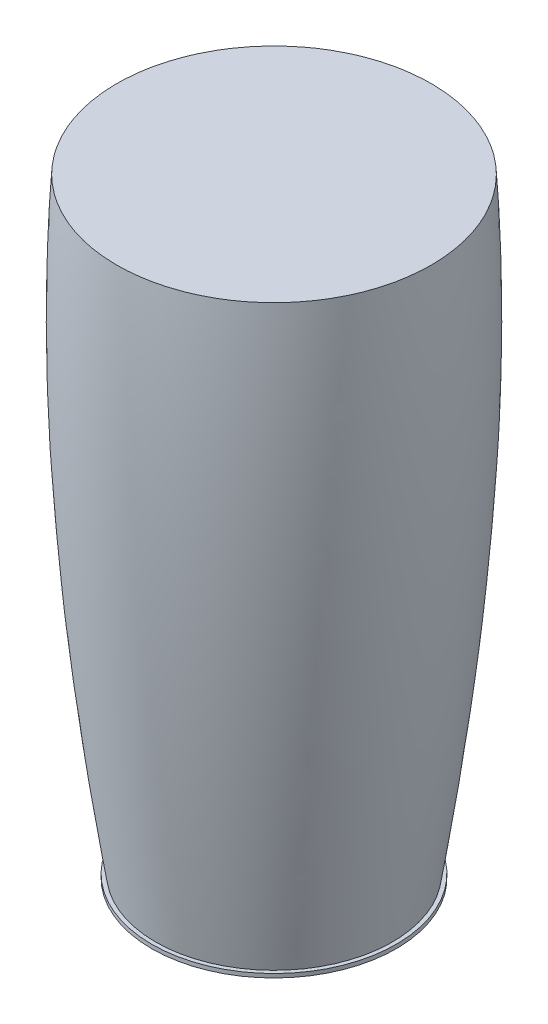
ISO-10303-21;
HEADER;
FILE_DESCRIPTION(('STEP AP214'),'2;1');
FILE_NAME('part.step','',(''),(''),'','','');
FILE_SCHEMA(('AUTOMOTIVE_DESIGN { 1 0 10303 214 1 1 1 1 }'));
ENDSEC;
DATA;
#1=APPLICATION_CONTEXT('core data for automotive mechanical design processes');
#2=APPLICATION_PROTOCOL_DEFINITION('international standard','automotive_design',2000,#1);
#3=PRODUCT_CONTEXT('',#1,'mechanical');
#4=PRODUCT('Part','Part','',(#3));
#5=PRODUCT_RELATED_PRODUCT_CATEGORY('part','',(#4));
#6=PRODUCT_DEFINITION_FORMATION('','',#4);
#7=PRODUCT_DEFINITION_CONTEXT('part definition',#1,'design');
#8=PRODUCT_DEFINITION('design','',#6,#7);
#9=PRODUCT_DEFINITION_SHAPE('','',#8);
#10=(LENGTH_UNIT() NAMED_UNIT(*) SI_UNIT(.MILLI.,.METRE.));
#11=(NAMED_UNIT(*) PLANE_ANGLE_UNIT() SI_UNIT($,.RADIAN.));
#12=(NAMED_UNIT(*) SI_UNIT($,.STERADIAN.) SOLID_ANGLE_UNIT());
#13=UNCERTAINTY_MEASURE_WITH_UNIT(LENGTH_MEASURE(1.E-05),#10,'distance_accuracy_value','');
#14=(GEOMETRIC_REPRESENTATION_CONTEXT(3) GLOBAL_UNCERTAINTY_ASSIGNED_CONTEXT((#13)) GLOBAL_UNIT_ASSIGNED_CONTEXT((#10,
#11,#12)) REPRESENTATION_CONTEXT('',''));
#15=CARTESIAN_POINT('',(0.,0.,0.));
#16=DIRECTION('',(0.,0.,1.));
#17=DIRECTION('',(1.,0.,0.));
#18=AXIS2_PLACEMENT_3D('',#15,#16,#17);
#19=CARTESIAN_POINT('',(0.,1.,0.));
#20=DIRECTION('',(0.,1.,0.));
#21=DIRECTION('',(0.,0.,1.));
#22=AXIS2_PLACEMENT_3D('',#19,#20,#21);
#23=PLANE('',#22);
#24=CARTESIAN_POINT('',(0.,1.,0.));
#25=DIRECTION('',(0.,1.,0.));
#26=DIRECTION('',(0.,0.,1.));
#27=AXIS2_PLACEMENT_3D('',#24,#25,#26);
#28=CIRCLE('',#27,31.5);
#29=CARTESIAN_POINT('',(0.,1.,31.5));
#30=VERTEX_POINT('',#29);
#31=EDGE_CURVE('E11',#30,#30,#28,.T.);
#32=ORIENTED_EDGE('',*,*,#31,.T.);
#33=EDGE_LOOP('',(#32));
#34=FACE_BOUND('',#33,.T.);
#35=CARTESIAN_POINT('',(0.,1.,30.5));
#36=CARTESIAN_POINT('',(-1.99622021113738,1.,30.5));
#37=CARTESIAN_POINT('',(-5.98860372197836,1.,30.1069005766433));
#38=CARTESIAN_POINT('',(-11.7471088562175,0.999999999999997,28.3600017935858));
#39=CARTESIAN_POINT('',(-17.0541550319744,1.,25.5233667280083));
#40=CARTESIAN_POINT('',(-21.7058434697171,1.,21.7058050700122));
#41=CARTESIAN_POINT('',(-25.5233621193165,1.,17.0541235463825));
#42=CARTESIAN_POINT('',(-28.3600384210798,1.,11.7470938791449));
#43=CARTESIAN_POINT('',(-30.1068435850172,1.,5.98861290712943));
#44=CARTESIAN_POINT('',(-30.6966743261942,0.999999999999998,-5.14611795017494E-07));
#45=CARTESIAN_POINT('',(-30.1068437438445,1.,-5.98861167144551));
#46=CARTESIAN_POINT('',(-28.3600380396234,0.999999999999998,-11.7470958223786));
#47=CARTESIAN_POINT('',(-25.5233629004458,1.,-17.0541200068778));
#48=CARTESIAN_POINT('',(-21.705841657347,0.999999999999998,-21.7058129926407));
#49=CARTESIAN_POINT('',(-17.0541585029317,1.,-25.5233516935576));
#50=CARTESIAN_POINT('',(-11.7471024831886,0.999999999999999,-28.3600293384688));
#51=CARTESIAN_POINT('',(-5.98861588752967,1.,-30.1068479892804));
#52=CARTESIAN_POINT('',(0.,1.,-30.6966694551992));
#53=CARTESIAN_POINT('',(5.98861588752953,0.999999999999999,-30.1068479892805));
#54=CARTESIAN_POINT('',(11.7471024831885,1.,-28.3600293384687));
#55=CARTESIAN_POINT('',(17.0541585029315,0.999999999999999,-25.5233516935577));
#56=CARTESIAN_POINT('',(21.7058416573471,1.,-21.7058129926409));
#57=CARTESIAN_POINT('',(25.5233629004457,0.999999999999997,-17.0541200068779));
#58=CARTESIAN_POINT('',(28.3600380396234,1.,-11.7470958223786));
#59=CARTESIAN_POINT('',(30.1068437438445,1.,-5.98861167144559));
#60=CARTESIAN_POINT('',(30.6966743261942,0.999999999999999,-5.14611899100903E-07));
#61=CARTESIAN_POINT('',(30.1068435850172,1.,5.98861290712939));
#62=CARTESIAN_POINT('',(28.3600384210799,1.,11.7470938791448));
#63=CARTESIAN_POINT('',(25.5233621193166,1.,17.0541235463825));
#64=CARTESIAN_POINT('',(21.7058434697173,1.,21.705805070012));
#65=CARTESIAN_POINT('',(17.0541550319745,0.999999999999999,25.5233667280082));
#66=CARTESIAN_POINT('',(11.7471088562177,1.,28.3600017935857));
#67=CARTESIAN_POINT('',(5.98860372197847,1.,30.1069005766432));
#68=CARTESIAN_POINT('',(1.99622021113738,1.,30.5));
#69=CARTESIAN_POINT('',(0.,1.,30.5));
#70=B_SPLINE_CURVE_WITH_KNOTS('',3,(#35,#36,#37,#38,#39,#40,#41,#42,#43,#44,#45,#46,#47,#48,#49,
#50,#51,#52,#53,#54,#55,#56,#57,#58,#59,#60,#61,#62,#63,#64,#65,#66,#67,#68,#69),.UNSPECIFIED.,
.T.,.F.,(4,1,1,1,1,1,1,1,1,1,1,1,1,1,1,1,1,1,1,1,1,1,1,1,1,1,1,1,1,1,1,1,4),(0.,0.03125,0.0625,
0.09375,0.125,0.15625,0.1875,0.21875,0.25,0.28125,0.3125,0.34375,0.375,0.40625,0.4375,0.46875,
0.5,0.53125,0.5625,0.59375,0.625,0.65625,0.6875,0.71875,0.75,0.78125,0.8125,0.84375,0.875,
0.90625,0.9375,0.96875,1.),.UNSPECIFIED.);
#71=CARTESIAN_POINT('',(0.,1.,30.5));
#72=VERTEX_POINT('',#71);
#73=EDGE_CURVE('E123',#72,#72,#70,.T.);
#74=ORIENTED_EDGE('',*,*,#73,.T.);
#75=EDGE_LOOP('',(#74));
#76=FACE_BOUND('',#75,.T.);
#77=ADVANCED_FACE('F103',(#34,#76),#23,.T.);
#78=CARTESIAN_POINT('',(0.,1.,0.));
#79=DIRECTION('',(0.,-1.,0.));
#80=DIRECTION('',(0.,0.,-1.));
#81=AXIS2_PLACEMENT_3D('',#78,#79,#80);
#82=CYLINDRICAL_SURFACE('',#81,31.5);
#83=ORIENTED_EDGE('',*,*,#31,.F.);
#84=EDGE_LOOP('',(#83));
#85=FACE_BOUND('',#84,.T.);
#86=CARTESIAN_POINT('',(0.,0.,0.));
#87=DIRECTION('',(0.,1.,0.));
#88=DIRECTION('',(0.,0.,1.));
#89=AXIS2_PLACEMENT_3D('',#86,#87,#88);
#90=CIRCLE('',#89,31.5);
#91=CARTESIAN_POINT('',(0.,0.,31.5));
#92=VERTEX_POINT('',#91);
#93=EDGE_CURVE('E107',#92,#92,#90,.T.);
#94=ORIENTED_EDGE('',*,*,#93,.T.);
#95=EDGE_LOOP('',(#94));
#96=FACE_BOUND('',#95,.T.);
#97=ADVANCED_FACE('F105',(#85,#96),#82,.T.);
#98=CARTESIAN_POINT('',(0.,0.,0.));
#99=DIRECTION('',(0.,1.,0.));
#100=DIRECTION('',(0.,0.,1.));
#101=AXIS2_PLACEMENT_3D('',#98,#99,#100);
#102=PLANE('',#101);
#103=ORIENTED_EDGE('',*,*,#93,.F.);
#104=EDGE_LOOP('',(#103));
#105=FACE_BOUND('',#104,.T.);
#106=ADVANCED_FACE('F145',(#105),#102,.F.);
#107=CARTESIAN_POINT('',(0.,157.,-40.5000826480815));
#108=DIRECTION('',(0.,1.,-3.19037673435257E-13));
#109=DIRECTION('',(0.,3.19037673435257E-13,1.));
#110=AXIS2_PLACEMENT_3D('',#107,#108,#109);
#111=PLANE('',#110);
#112=CARTESIAN_POINT('',(0.,157.,40.5));
#113=CARTESIAN_POINT('',(-2.65071864101849,157.,40.5));
#114=CARTESIAN_POINT('',(-7.95209506455382,157.,39.9780132016993));
#115=CARTESIAN_POINT('',(-15.5986293166789,157.,37.6583593965726));
#116=CARTESIAN_POINT('',(-22.6457169707221,157.,33.8916585003829));
#117=CARTESIAN_POINT('',(-28.8225030570713,157.,28.8224679224125));
#118=CARTESIAN_POINT('',(-33.8916699508598,157.,22.6456765505676));
#119=CARTESIAN_POINT('',(-37.6583999857154,157.,15.5986099267401));
#120=CARTESIAN_POINT('',(-39.9779422169951,157.,7.95210456081741));
#121=CARTESIAN_POINT('',(-40.7611553267145,157.,-6.90929732698187E-07));
#122=CARTESIAN_POINT('',(-39.977942385127,157.,-7.95210290483793));
#123=CARTESIAN_POINT('',(-37.6583995864274,157.000000000001,-15.5986125030768));
#124=CARTESIAN_POINT('',(-33.8916707297547,157.,-22.6456720763332));
#125=CARTESIAN_POINT('',(-28.8225016026876,157.,-28.8224760051253));
#126=CARTESIAN_POINT('',(-22.645719751295,157.,-33.8916431970529));
#127=CARTESIAN_POINT('',(-15.598623086299,157.,-37.6583935264467));
#128=CARTESIAN_POINT('',(-7.95210765041901,157.,-39.9779447110385));
#129=CARTESIAN_POINT('',(0.,157.,-40.761151616603));
#130=CARTESIAN_POINT('',(7.95210765041916,157.,-39.9779447110386));
#131=CARTESIAN_POINT('',(15.5986230862991,156.999999999999,-37.6583935264466));
#132=CARTESIAN_POINT('',(22.6457197512951,157.000000000001,-33.8916431970528));
#133=CARTESIAN_POINT('',(28.8225016026877,156.999999999999,-28.8224760051253));
#134=CARTESIAN_POINT('',(33.8916707297546,157.000000000001,-22.6456720763331));
#135=CARTESIAN_POINT('',(37.6583995864276,156.999999999999,-15.5986125030769));
#136=CARTESIAN_POINT('',(39.9779423851268,157.000000000001,-7.95210290483785));
#137=CARTESIAN_POINT('',(40.7611553267147,156.999999999999,-6.90929809893381E-07));
#138=CARTESIAN_POINT('',(39.977942216995,157.,7.9521045608173));
#139=CARTESIAN_POINT('',(37.6583999857158,157.,15.5986099267401));
#140=CARTESIAN_POINT('',(33.8916699508596,156.999999999999,22.6456765505674));
#141=CARTESIAN_POINT('',(28.8225030570716,157.,28.8224679224126));
#142=CARTESIAN_POINT('',(22.6457169707219,157.,33.8916585003828));
#143=CARTESIAN_POINT('',(15.5986293166791,157.,37.6583593965725));
#144=CARTESIAN_POINT('',(7.95209506455382,157.,39.9780132016993));
#145=CARTESIAN_POINT('',(2.65071864101849,157.,40.5));
#146=CARTESIAN_POINT('',(0.,157.,40.5));
#147=B_SPLINE_CURVE_WITH_KNOTS('',3,(#112,#113,#114,#115,#116,#117,#118,#119,#120,#121,#122,
#123,#124,#125,#126,#127,#128,#129,#130,#131,#132,#133,#134,#135,#136,#137,#138,#139,#140,#141,
#142,#143,#144,#145,#146),.UNSPECIFIED.,.T.,.F.,(4,1,1,1,1,1,1,1,1,1,1,1,1,1,1,1,1,1,1,1,1,1,1,
1,1,1,1,1,1,1,1,1,4),(0.,0.03125,0.0625,0.09375,0.125,0.15625,0.1875,0.21875,0.25,0.28125,
0.3125,0.34375,0.375,0.40625,0.4375,0.46875,0.5,0.53125,0.5625,0.59375,0.625,0.65625,0.6875,
0.71875,0.75,0.78125,0.8125,0.84375,0.875,0.90625,0.9375,0.96875,1.),.UNSPECIFIED.);
#148=CARTESIAN_POINT('',(0.,157.,40.5));
#149=VERTEX_POINT('',#148);
#150=EDGE_CURVE('E116',#149,#149,#147,.F.);
#151=ORIENTED_EDGE('',*,*,#150,.T.);
#152=EDGE_LOOP('',(#151));
#153=FACE_BOUND('',#152,.T.);
#154=ADVANCED_FACE('F140',(#153),#111,.T.);
#155=CARTESIAN_POINT('',(0.,1.,30.5));
#156=CARTESIAN_POINT('',(0.,30.9099688983467,35.2378185191248));
#157=CARTESIAN_POINT('',(0.,82.775397131605,41.4541688774488));
#158=CARTESIAN_POINT('',(0.,134.909968898347,41.9044851857914));
#159=CARTESIAN_POINT('',(0.,157.,40.5));
#160=CARTESIAN_POINT('',(-1.99622021113738,1.,30.5));
#161=CARTESIAN_POINT('',(-2.30630914730129,30.9099688983467,35.2378185191248));
#162=CARTESIAN_POINT('',(-2.71316915303624,82.7753971316051,41.4541688774488));
#163=CARTESIAN_POINT('',(-2.74264181369548,134.909968898347,41.9044851857914));
#164=CARTESIAN_POINT('',(-2.65071864101849,157.,40.5));
#165=CARTESIAN_POINT('',(-5.98860372197836,1.,30.1069005766433));
#166=CARTESIAN_POINT('',(-6.9188705304701,30.9099682091233,34.7836545530013));
#167=CARTESIAN_POINT('',(-8.13944516220064,82.7753978555918,40.919884092737));
#168=CARTESIAN_POINT('',(-8.22786458258481,134.909968209123,41.3643963030387));
#169=CARTESIAN_POINT('',(-7.95209506455382,157.,39.9780132016993));
#170=CARTESIAN_POINT('',(-11.7471088562175,0.999999999999997,28.3600017935858));
#171=CARTESIAN_POINT('',(-13.5718892790268,30.9099686972532,32.7653948666895));
#172=CARTESIAN_POINT('',(-15.9661294570411,82.7753973428411,38.5455797525667));
#173=CARTESIAN_POINT('',(-16.1395696332322,134.909968697253,38.9642999353474));
#174=CARTESIAN_POINT('',(-15.5986293166789,157.,37.6583593965726));
#175=CARTESIAN_POINT('',(-17.0541550319744,1.,25.5233667280083));
#176=CARTESIAN_POINT('',(-19.7033356056188,30.9099684640254,29.4881114778033));
#177=CARTESIAN_POINT('',(-23.1792464138484,82.7753975878331,34.690134881692));
#178=CARTESIAN_POINT('',(-23.4310435521284,134.909968464026,35.0669726593864));
#179=CARTESIAN_POINT('',(-22.6457169707221,157.,33.8916585003829));
#180=CARTESIAN_POINT('',(-21.7058434697171,1.,21.7058050700122));
#181=CARTESIAN_POINT('',(-25.0775876075815,30.9099685453284,25.0775507591711));
#182=CARTESIAN_POINT('',(-29.5015525856253,82.7753975024282,29.5015177602378));
#183=CARTESIAN_POINT('',(-29.8220273358754,134.909968545328,29.8219926607713));
#184=CARTESIAN_POINT('',(-28.8225030570713,157.,28.8224679224125));
#185=CARTESIAN_POINT('',(-25.5233621193165,1.,17.0541235463825));
#186=CARTESIAN_POINT('',(-29.4881144718207,30.9099683283522,19.7032998636601));
#187=CARTESIAN_POINT('',(-34.690147871236,82.7753977303498,23.1792051570139));
#188=CARTESIAN_POINT('',(-35.0669863586077,134.909968328352,23.4310018664502));
#189=CARTESIAN_POINT('',(-33.8916699508598,157.,22.6456765505676));
#190=CARTESIAN_POINT('',(-28.3600384210798,1.,11.7470938791449));
#191=CARTESIAN_POINT('',(-32.7654333668334,30.9099686392571,13.5718722787835));
#192=CARTESIAN_POINT('',(-38.5456207240754,82.7753974037619,15.9661096074686));
#193=CARTESIAN_POINT('',(-38.964341076834,134.909968639257,16.1395496438469));
#194=CARTESIAN_POINT('',(-37.6583999857154,157.,15.5986099267401));
#195=CARTESIAN_POINT('',(-30.1068435850172,1.,5.98861290712943));
#196=CARTESIAN_POINT('',(-34.7835909478753,30.9099684603238,6.91887961323657));
#197=CARTESIAN_POINT('',(-40.9198117559197,82.7753975917213,8.13945482960933));
#198=CARTESIAN_POINT('',(-41.3643233691286,134.909968460324,8.22787404902857));
#199=CARTESIAN_POINT('',(-39.9779422169951,157.,7.95210456081741));
#200=CARTESIAN_POINT('',(-30.6966743261942,0.999999999999998,-5.14611795017494E-07));
#201=CARTESIAN_POINT('',(-35.4650427520111,30.9099685732601,-5.98135990179842E-07));
#202=CARTESIAN_POINT('',(-41.7214768027538,82.7753974730881,-7.07766092301794E-07));
#203=CARTESIAN_POINT('',(-42.1746967523754,134.90996857326,-7.15681282857202E-07));
#204=CARTESIAN_POINT('',(-40.7611553267145,157.,-6.90929732698187E-07));
#205=CARTESIAN_POINT('',(-30.1068437438445,1.,-5.98861167144551));
#206=CARTESIAN_POINT('',(-34.7835911111143,30.9099684619398,-6.91887817847242));
#207=CARTESIAN_POINT('',(-40.9198119248942,82.7753975900242,-8.13945313347596));
#208=CARTESIAN_POINT('',(-41.3643235386313,134.90996846194,-8.22787233406737));
#209=CARTESIAN_POINT('',(-39.977942385127,157.,-7.95210290483793));
#210=CARTESIAN_POINT('',(-28.3600380396234,0.999999999999998,-11.7470958223786));
#211=CARTESIAN_POINT('',(-32.7654329770465,30.9099686348852,-13.5718745218274));
#212=CARTESIAN_POINT('',(-38.5456203231283,82.7753974083542,-15.9661122443636));
#213=CARTESIAN_POINT('',(-38.9643406749171,134.909968634886,-16.1395523089596));
#214=CARTESIAN_POINT('',(-37.6583995864274,157.000000000001,-15.5986125030768));
#215=CARTESIAN_POINT('',(-25.5233629004458,1.,-17.0541200068778));
#216=CARTESIAN_POINT('',(-29.4881152510011,30.9099683372086,-19.7032958816469));
#217=CARTESIAN_POINT('',(-34.6901486502296,82.7753977210465,-23.1792005932234));
#218=CARTESIAN_POINT('',(-35.0669871372067,134.909968337208,-23.4309972612838));
#219=CARTESIAN_POINT('',(-33.8916707297547,157.,-22.6456720763332));
#220=CARTESIAN_POINT('',(-21.705841657347,0.999999999999998,-21.7058129926407));
#221=CARTESIAN_POINT('',(-25.077585969563,30.9099685386838,-25.0775587572586));
#222=CARTESIAN_POINT('',(-29.5015511627425,82.7753975094083,-29.5015258586308));
#223=CARTESIAN_POINT('',(-29.8220259331234,134.909968538684,-29.8220007655817));
#224=CARTESIAN_POINT('',(-28.8225016026876,157.,-28.8224760051253));
#225=CARTESIAN_POINT('',(-17.0541585029317,1.,-25.5233516935576));
#226=CARTESIAN_POINT('',(-19.7033387312971,30.9099684795152,-29.488096317056));
#227=CARTESIAN_POINT('',(-23.1792491389698,82.7753975715615,-34.6901195515578));
#228=CARTESIAN_POINT('',(-23.431046230206,134.909968479515,-35.0669573193861));
#229=CARTESIAN_POINT('',(-22.645719751295,157.,-33.8916431970529));
#230=CARTESIAN_POINT('',(-11.7471024831886,0.999999999999999,-28.3600293384688));
#231=CARTESIAN_POINT('',(-13.5718830393795,30.9099685799283,-32.7654255241289));
#232=CARTESIAN_POINT('',(-15.9661232035579,82.775397466084,-38.5456145184209));
#233=CARTESIAN_POINT('',(-16.1395634414531,134.909968579928,-38.9643349827809));
#234=CARTESIAN_POINT('',(-15.598623086299,157.,-37.6583935264467));
#235=CARTESIAN_POINT('',(-5.98861588752967,1.,-30.1068479892804));
#236=CARTESIAN_POINT('',(-6.91888264597502,30.9099684924156,-34.7835944489242));
#237=CARTESIAN_POINT('',(-8.1394579289997,82.7753975580103,-40.9198140657464));
#238=CARTESIAN_POINT('',(-8.22787715456793,134.909968492416,-41.364325596763));
#239=CARTESIAN_POINT('',(-7.95210765041901,157.,-39.9779447110385));
#240=CARTESIAN_POINT('',(0.,1.,-30.6966694551992));
#241=CARTESIAN_POINT('',(0.,30.9099685539698,-35.4650384298821));
#242=CARTESIAN_POINT('',(0.,82.7753974933517,-41.7214732046193));
#243=CARTESIAN_POINT('',(0.,134.909968553969,-42.1746932041513));
#244=CARTESIAN_POINT('',(0.,157.,-40.761151616603));
#245=CARTESIAN_POINT('',(5.98861588752953,0.999999999999999,-30.1068479892805));
#246=CARTESIAN_POINT('',(6.91888264597503,30.9099684924156,-34.7835944489242));
#247=CARTESIAN_POINT('',(8.13945792899989,82.7753975580104,-40.9198140657465));
#248=CARTESIAN_POINT('',(8.2278771545681,134.909968492416,-41.364325596763));
#249=CARTESIAN_POINT('',(7.95210765041916,157.,-39.9779447110386));
#250=CARTESIAN_POINT('',(11.7471024831885,1.,-28.3600293384687));
#251=CARTESIAN_POINT('',(13.5718830393794,30.9099685799283,-32.7654255241288));
#252=CARTESIAN_POINT('',(15.966123203558,82.7753974660839,-38.5456145184208));
#253=CARTESIAN_POINT('',(16.1395634414531,134.909968579928,-38.9643349827807));
#254=CARTESIAN_POINT('',(15.5986230862991,156.999999999999,-37.6583935264466));
#255=CARTESIAN_POINT('',(17.0541585029315,0.999999999999999,-25.5233516935577));
#256=CARTESIAN_POINT('',(19.7033387312971,30.9099684795152,-29.488096317056));
#257=CARTESIAN_POINT('',(23.17924913897,82.7753975715616,-34.6901195515577));
#258=CARTESIAN_POINT('',(23.4310462302061,134.909968479516,-35.0669573193861));
#259=CARTESIAN_POINT('',(22.6457197512951,157.000000000001,-33.8916431970528));
#260=CARTESIAN_POINT('',(21.7058416573471,1.,-21.7058129926409));
#261=CARTESIAN_POINT('',(25.0775859695631,30.9099685386838,-25.0775587572587));
#262=CARTESIAN_POINT('',(29.5015511627426,82.7753975094086,-29.5015258586308));
#263=CARTESIAN_POINT('',(29.8220259331236,134.909968538683,-29.8220007655817));
#264=CARTESIAN_POINT('',(28.8225016026877,156.999999999999,-28.8224760051253));
#265=CARTESIAN_POINT('',(25.5233629004457,0.999999999999997,-17.0541200068779));
#266=CARTESIAN_POINT('',(29.4881152510011,30.9099683372085,-19.7032958816469));
#267=CARTESIAN_POINT('',(34.6901486502296,82.7753977210458,-23.1792005932233));
#268=CARTESIAN_POINT('',(35.0669871372067,134.909968337209,-23.4309972612836));
#269=CARTESIAN_POINT('',(33.8916707297546,157.000000000001,-22.6456720763331));
#270=CARTESIAN_POINT('',(28.3600380396234,1.,-11.7470958223786));
#271=CARTESIAN_POINT('',(32.7654329770466,30.9099686348853,-13.5718745218275));
#272=CARTESIAN_POINT('',(38.5456203231285,82.7753974083549,-15.9661122443637));
#273=CARTESIAN_POINT('',(38.9643406749173,134.909968634885,-16.1395523089596));
#274=CARTESIAN_POINT('',(37.6583995864276,156.999999999999,-15.5986125030769));
#275=CARTESIAN_POINT('',(30.1068437438445,1.,-5.98861167144559));
#276=CARTESIAN_POINT('',(34.7835911111143,30.9099684619397,-6.91887817847243));
#277=CARTESIAN_POINT('',(40.9198119248941,82.7753975900236,-8.13945313347586));
#278=CARTESIAN_POINT('',(41.3643235386311,134.90996846194,-8.22787233406726));
#279=CARTESIAN_POINT('',(39.9779423851268,157.000000000001,-7.95210290483785));
#280=CARTESIAN_POINT('',(30.6966743261942,0.999999999999999,-5.14611899100903E-07));
#281=CARTESIAN_POINT('',(35.4650427520112,30.9099685732602,-5.98136084595781E-07));
#282=CARTESIAN_POINT('',(41.721476802754,82.7753974730887,-7.07766166262544E-07));
#283=CARTESIAN_POINT('',(42.1746967523757,134.90996857326,-7.15681355619238E-07));
#284=CARTESIAN_POINT('',(40.7611553267147,156.999999999999,-6.90929809893381E-07));
#285=CARTESIAN_POINT('',(30.1068435850172,1.,5.98861290712939));
#286=CARTESIAN_POINT('',(34.7835909478752,30.9099684603236,6.91887961323652));
#287=CARTESIAN_POINT('',(40.9198117559195,82.7753975917208,8.13945482960921));
#288=CARTESIAN_POINT('',(41.3643233691285,134.909968460324,8.22787404902844));
#289=CARTESIAN_POINT('',(39.977942216995,157.,7.9521045608173));
#290=CARTESIAN_POINT('',(28.3600384210799,1.,11.7470938791448));
#291=CARTESIAN_POINT('',(32.7654333668336,30.9099686392573,13.5718722787834));
#292=CARTESIAN_POINT('',(38.5456207240758,82.7753974037626,15.9661096074686));
#293=CARTESIAN_POINT('',(38.9643410768343,134.909968639258,16.1395496438469));
#294=CARTESIAN_POINT('',(37.6583999857158,157.,15.5986099267401));
#295=CARTESIAN_POINT('',(25.5233621193166,1.,17.0541235463825));
#296=CARTESIAN_POINT('',(29.4881144718207,30.909968328352,19.70329986366));
#297=CARTESIAN_POINT('',(34.6901478712357,82.7753977303492,23.1792051570136));
#298=CARTESIAN_POINT('',(35.0669863586074,134.909968328351,23.4310018664499));
#299=CARTESIAN_POINT('',(33.8916699508596,156.999999999999,22.6456765505674));
#300=CARTESIAN_POINT('',(21.7058434697173,1.,21.705805070012));
#301=CARTESIAN_POINT('',(25.0775876075817,30.9099685453285,25.0775507591711));
#302=CARTESIAN_POINT('',(29.5015525856257,82.7753975024286,29.5015177602379));
#303=CARTESIAN_POINT('',(29.8220273358757,134.909968545329,29.8219926607714));
#304=CARTESIAN_POINT('',(28.8225030570716,157.,28.8224679224126));
#305=CARTESIAN_POINT('',(17.0541550319745,0.999999999999999,25.5233667280082));
#306=CARTESIAN_POINT('',(19.7033356056187,30.9099684640253,29.4881114778033));
#307=CARTESIAN_POINT('',(23.1792464138481,82.7753975878331,34.6901348816919));
#308=CARTESIAN_POINT('',(23.4310435521281,134.909968464025,35.0669726593863));
#309=CARTESIAN_POINT('',(22.6457169707219,157.,33.8916585003828));
#310=CARTESIAN_POINT('',(11.7471088562177,1.,28.3600017935857));
#311=CARTESIAN_POINT('',(13.571889279027,30.9099686972532,32.7653948666895));
#312=CARTESIAN_POINT('',(15.9661294570413,82.7753973428411,38.5455797525665));
#313=CARTESIAN_POINT('',(16.1395696332325,134.909968697253,38.9642999353473));
#314=CARTESIAN_POINT('',(15.5986293166791,157.,37.6583593965725));
#315=CARTESIAN_POINT('',(5.98860372197847,1.,30.1069005766432));
#316=CARTESIAN_POINT('',(6.91887053047016,30.9099682091232,34.7836545530013));
#317=CARTESIAN_POINT('',(8.13944516220062,82.7753978555915,40.9198840927369));
#318=CARTESIAN_POINT('',(8.22786458258478,134.909968209123,41.3643963030388));
#319=CARTESIAN_POINT('',(7.95209506455382,157.,39.9780132016993));
#320=CARTESIAN_POINT('',(1.99622021113738,1.,30.5));
#321=CARTESIAN_POINT('',(2.30630914730129,30.9099688983467,35.2378185191248));
#322=CARTESIAN_POINT('',(2.71316915303624,82.775397131605,41.4541688774488));
#323=CARTESIAN_POINT('',(2.74264181369548,134.909968898347,41.9044851857915));
#324=CARTESIAN_POINT('',(2.65071864101849,157.,40.5));
#325=CARTESIAN_POINT('',(0.,1.,30.5));
#326=CARTESIAN_POINT('',(0.,30.9099688983467,35.2378185191248));
#327=CARTESIAN_POINT('',(0.,82.775397131605,41.4541688774488));
#328=CARTESIAN_POINT('',(0.,134.909968898347,41.9044851857914));
#329=CARTESIAN_POINT('',(0.,157.,40.5));
#330=B_SPLINE_SURFACE_WITH_KNOTS('',3,3,((#155,#156,#157,#158,#159),(#160,#161,#162,#163,#164),
(#165,#166,#167,#168,#169),(#170,#171,#172,#173,#174),(#175,#176,#177,#178,#179),(#180,#181,
#182,#183,#184),(#185,#186,#187,#188,#189),(#190,#191,#192,#193,#194),(#195,#196,#197,#198,
#199),(#200,#201,#202,#203,#204),(#205,#206,#207,#208,#209),(#210,#211,#212,#213,#214),(#215,
#216,#217,#218,#219),(#220,#221,#222,#223,#224),(#225,#226,#227,#228,#229),(#230,#231,#232,#233,
#234),(#235,#236,#237,#238,#239),(#240,#241,#242,#243,#244),(#245,#246,#247,#248,#249),(#250,
#251,#252,#253,#254),(#255,#256,#257,#258,#259),(#260,#261,#262,#263,#264),(#265,#266,#267,#268,
#269),(#270,#271,#272,#273,#274),(#275,#276,#277,#278,#279),(#280,#281,#282,#283,#284),(#285,
#286,#287,#288,#289),(#290,#291,#292,#293,#294),(#295,#296,#297,#298,#299),(#300,#301,#302,#303,
#304),(#305,#306,#307,#308,#309),(#310,#311,#312,#313,#314),(#315,#316,#317,#318,#319),(#320,
#321,#322,#323,#324),(#325,#326,#327,#328,#329)),.UNSPECIFIED.,.T.,.F.,.F.,(4,1,1,1,1,1,1,1,1,1,
1,1,1,1,1,1,1,1,1,1,1,1,1,1,1,1,1,1,1,1,1,1,4),(4,1,4),(0.,0.03125,0.0625,0.09375,0.125,0.15625,
0.1875,0.21875,0.25,0.28125,0.3125,0.34375,0.375,0.40625,0.4375,0.46875,0.5,0.53125,0.5625,
0.59375,0.625,0.65625,0.6875,0.71875,0.75,0.78125,0.8125,0.84375,0.875,0.90625,0.9375,0.96875,
1.),(0.,0.578419825397842,1.),.UNSPECIFIED.);
#331=ORIENTED_EDGE('',*,*,#73,.F.);
#332=EDGE_LOOP('',(#331));
#333=FACE_BOUND('',#332,.T.);
#334=ORIENTED_EDGE('',*,*,#150,.F.);
#335=EDGE_LOOP('',(#334));
#336=FACE_BOUND('',#335,.T.);
#337=ADVANCED_FACE('F137',(#333,#336),#330,.F.);
#338=CLOSED_SHELL('',(#77,#97,#106,#154,#337));
#339=MANIFOLD_SOLID_BREP('B2',#338);
#340=ADVANCED_BREP_SHAPE_REPRESENTATION('',(#18,#339),#14);
#341=SHAPE_DEFINITION_REPRESENTATION(#9,#340);
ENDSEC;
END-ISO-10303-21;
